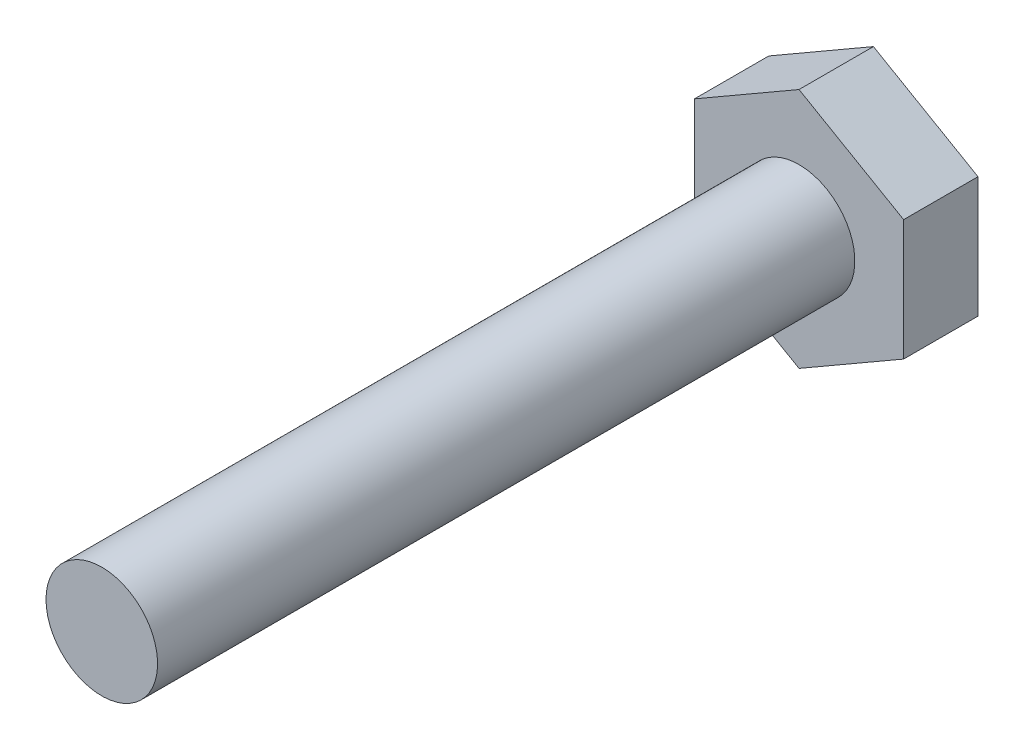
ISO-10303-21;
HEADER;
FILE_DESCRIPTION(('STEP AP214'),'2;1');
FILE_NAME('part.step','',(''),(''),'','','');
FILE_SCHEMA(('AUTOMOTIVE_DESIGN { 1 0 10303 214 1 1 1 1 }'));
ENDSEC;
DATA;
#1=APPLICATION_CONTEXT('core data for automotive mechanical design processes');
#2=APPLICATION_PROTOCOL_DEFINITION('international standard','automotive_design',2000,#1);
#3=PRODUCT_CONTEXT('',#1,'mechanical');
#4=PRODUCT('Part','Part','',(#3));
#5=PRODUCT_RELATED_PRODUCT_CATEGORY('part','',(#4));
#6=PRODUCT_DEFINITION_FORMATION('','',#4);
#7=PRODUCT_DEFINITION_CONTEXT('part definition',#1,'design');
#8=PRODUCT_DEFINITION('design','',#6,#7);
#9=PRODUCT_DEFINITION_SHAPE('','',#8);
#10=(LENGTH_UNIT() NAMED_UNIT(*) SI_UNIT(.MILLI.,.METRE.));
#11=(NAMED_UNIT(*) PLANE_ANGLE_UNIT() SI_UNIT($,.RADIAN.));
#12=(NAMED_UNIT(*) SI_UNIT($,.STERADIAN.) SOLID_ANGLE_UNIT());
#13=UNCERTAINTY_MEASURE_WITH_UNIT(LENGTH_MEASURE(1.E-05),#10,'distance_accuracy_value','');
#14=(GEOMETRIC_REPRESENTATION_CONTEXT(3) GLOBAL_UNCERTAINTY_ASSIGNED_CONTEXT((#13)) GLOBAL_UNIT_ASSIGNED_CONTEXT((#10,
#11,#12)) REPRESENTATION_CONTEXT('',''));
#15=CARTESIAN_POINT('',(0.,0.,0.));
#16=DIRECTION('',(0.,0.,1.));
#17=DIRECTION('',(1.,0.,0.));
#18=AXIS2_PLACEMENT_3D('',#15,#16,#17);
#19=CARTESIAN_POINT('',(-5.715,3.29955678841871,4.064));
#20=DIRECTION('',(0.5,-0.866025403784439,0.));
#21=DIRECTION('',(0.866025403784439,0.5,0.));
#22=AXIS2_PLACEMENT_3D('',#19,#20,#21);
#23=PLANE('',#22);
#24=DIRECTION('',(-0.866025403784439,-0.5,0.));
#25=VECTOR('',#24,1.);
#26=CARTESIAN_POINT('',(-5.715,3.29955678841871,0.));
#27=LINE('',#26,#25);
#28=CARTESIAN_POINT('',(0.,6.59911357683743,0.));
#29=VERTEX_POINT('',#28);
#30=CARTESIAN_POINT('',(-5.715,3.29955678841871,0.));
#31=VERTEX_POINT('',#30);
#32=EDGE_CURVE('E119',#29,#31,#27,.T.);
#33=ORIENTED_EDGE('',*,*,#32,.T.);
#34=DIRECTION('',(0.,0.,-1.));
#35=VECTOR('',#34,1.);
#36=CARTESIAN_POINT('',(-5.715,3.29955678841871,4.064));
#37=LINE('',#36,#35);
#38=CARTESIAN_POINT('',(-5.715,3.29955678841871,4.064));
#39=VERTEX_POINT('',#38);
#40=EDGE_CURVE('E36',#39,#31,#37,.T.);
#41=ORIENTED_EDGE('',*,*,#40,.F.);
#42=DIRECTION('',(-0.866025403784439,-0.5,0.));
#43=VECTOR('',#42,1.);
#44=CARTESIAN_POINT('',(-5.715,3.29955678841871,4.064));
#45=LINE('',#44,#43);
#46=CARTESIAN_POINT('',(0.,6.59911357683743,4.064));
#47=VERTEX_POINT('',#46);
#48=EDGE_CURVE('E130',#47,#39,#45,.T.);
#49=ORIENTED_EDGE('',*,*,#48,.F.);
#50=DIRECTION('',(0.,0.,-1.));
#51=VECTOR('',#50,1.);
#52=CARTESIAN_POINT('',(0.,6.59911357683743,4.064));
#53=LINE('',#52,#51);
#54=EDGE_CURVE('E115',#47,#29,#53,.T.);
#55=ORIENTED_EDGE('',*,*,#54,.T.);
#56=EDGE_LOOP('',(#33,#41,#49,#55));
#57=FACE_BOUND('',#56,.T.);
#58=ADVANCED_FACE('F33',(#57),#23,.F.);
#59=CARTESIAN_POINT('',(-5.715,3.29955678841871,4.064));
#60=DIRECTION('',(1.,0.,0.));
#61=DIRECTION('',(0.,0.,-1.));
#62=AXIS2_PLACEMENT_3D('',#59,#60,#61);
#63=PLANE('',#62);
#64=DIRECTION('',(0.,-1.,0.));
#65=VECTOR('',#64,1.);
#66=CARTESIAN_POINT('',(-5.715,3.29955678841871,0.));
#67=LINE('',#66,#65);
#68=CARTESIAN_POINT('',(-5.715,-3.29955678841871,0.));
#69=VERTEX_POINT('',#68);
#70=EDGE_CURVE('E122',#31,#69,#67,.T.);
#71=ORIENTED_EDGE('',*,*,#70,.T.);
#72=DIRECTION('',(0.,0.,-1.));
#73=VECTOR('',#72,1.);
#74=CARTESIAN_POINT('',(-5.715,-3.29955678841871,4.064));
#75=LINE('',#74,#73);
#76=CARTESIAN_POINT('',(-5.715,-3.29955678841871,4.064));
#77=VERTEX_POINT('',#76);
#78=EDGE_CURVE('E133',#77,#69,#75,.T.);
#79=ORIENTED_EDGE('',*,*,#78,.F.);
#80=DIRECTION('',(0.,-1.,0.));
#81=VECTOR('',#80,1.);
#82=CARTESIAN_POINT('',(-5.715,3.29955678841871,4.064));
#83=LINE('',#82,#81);
#84=EDGE_CURVE('E88',#39,#77,#83,.T.);
#85=ORIENTED_EDGE('',*,*,#84,.F.);
#86=ORIENTED_EDGE('',*,*,#40,.T.);
#87=EDGE_LOOP('',(#71,#79,#85,#86));
#88=FACE_BOUND('',#87,.T.);
#89=ADVANCED_FACE('F138',(#88),#63,.F.);
#90=CARTESIAN_POINT('',(-5.715,-3.29955678841871,4.064));
#91=DIRECTION('',(0.5,0.866025403784439,0.));
#92=DIRECTION('',(-0.866025403784439,0.5,0.));
#93=AXIS2_PLACEMENT_3D('',#90,#91,#92);
#94=PLANE('',#93);
#95=DIRECTION('',(0.866025403784439,-0.5,0.));
#96=VECTOR('',#95,1.);
#97=CARTESIAN_POINT('',(-5.715,-3.29955678841871,0.));
#98=LINE('',#97,#96);
#99=CARTESIAN_POINT('',(0.,-6.59911357683743,0.));
#100=VERTEX_POINT('',#99);
#101=EDGE_CURVE('E125',#69,#100,#98,.T.);
#102=ORIENTED_EDGE('',*,*,#101,.T.);
#103=DIRECTION('',(0.,0.,-1.));
#104=VECTOR('',#103,1.);
#105=CARTESIAN_POINT('',(0.,-6.59911357683743,4.064));
#106=LINE('',#105,#104);
#107=CARTESIAN_POINT('',(0.,-6.59911357683743,4.064));
#108=VERTEX_POINT('',#107);
#109=EDGE_CURVE('E110',#108,#100,#106,.T.);
#110=ORIENTED_EDGE('',*,*,#109,.F.);
#111=DIRECTION('',(0.866025403784439,-0.5,0.));
#112=VECTOR('',#111,1.);
#113=CARTESIAN_POINT('',(-5.715,-3.29955678841871,4.064));
#114=LINE('',#113,#112);
#115=EDGE_CURVE('E101',#77,#108,#114,.T.);
#116=ORIENTED_EDGE('',*,*,#115,.F.);
#117=ORIENTED_EDGE('',*,*,#78,.T.);
#118=EDGE_LOOP('',(#102,#110,#116,#117));
#119=FACE_BOUND('',#118,.T.);
#120=ADVANCED_FACE('F144',(#119),#94,.F.);
#121=CARTESIAN_POINT('',(0.,-6.59911357683743,4.064));
#122=DIRECTION('',(-0.500000000000001,0.866025403784438,0.));
#123=DIRECTION('',(-0.866025403784438,-0.500000000000001,0.));
#124=AXIS2_PLACEMENT_3D('',#121,#122,#123);
#125=PLANE('',#124);
#126=DIRECTION('',(0.866025403784438,0.500000000000001,0.));
#127=VECTOR('',#126,1.);
#128=CARTESIAN_POINT('',(0.,-6.59911357683743,0.));
#129=LINE('',#128,#127);
#130=CARTESIAN_POINT('',(5.715,-3.29955678841871,0.));
#131=VERTEX_POINT('',#130);
#132=EDGE_CURVE('E109',#100,#131,#129,.T.);
#133=ORIENTED_EDGE('',*,*,#132,.T.);
#134=DIRECTION('',(0.,0.,-1.));
#135=VECTOR('',#134,1.);
#136=CARTESIAN_POINT('',(5.715,-3.29955678841871,4.064));
#137=LINE('',#136,#135);
#138=CARTESIAN_POINT('',(5.715,-3.29955678841871,4.064));
#139=VERTEX_POINT('',#138);
#140=EDGE_CURVE('E106',#139,#131,#137,.T.);
#141=ORIENTED_EDGE('',*,*,#140,.F.);
#142=DIRECTION('',(0.866025403784438,0.500000000000001,0.));
#143=VECTOR('',#142,1.);
#144=CARTESIAN_POINT('',(0.,-6.59911357683743,4.064));
#145=LINE('',#144,#143);
#146=EDGE_CURVE('E95',#108,#139,#145,.T.);
#147=ORIENTED_EDGE('',*,*,#146,.F.);
#148=ORIENTED_EDGE('',*,*,#109,.T.);
#149=EDGE_LOOP('',(#133,#141,#147,#148));
#150=FACE_BOUND('',#149,.T.);
#151=ADVANCED_FACE('F107',(#150),#125,.F.);
#152=CARTESIAN_POINT('',(5.715,3.29955678841871,4.064));
#153=DIRECTION('',(-1.,0.,0.));
#154=DIRECTION('',(0.,-1.,0.));
#155=AXIS2_PLACEMENT_3D('',#152,#153,#154);
#156=PLANE('',#155);
#157=DIRECTION('',(0.,1.,0.));
#158=VECTOR('',#157,1.);
#159=CARTESIAN_POINT('',(5.715,3.29955678841871,0.));
#160=LINE('',#159,#158);
#161=CARTESIAN_POINT('',(5.715,3.29955678841871,0.));
#162=VERTEX_POINT('',#161);
#163=EDGE_CURVE('E73',#131,#162,#160,.T.);
#164=ORIENTED_EDGE('',*,*,#163,.T.);
#165=DIRECTION('',(0.,0.,-1.));
#166=VECTOR('',#165,1.);
#167=CARTESIAN_POINT('',(5.715,3.29955678841871,4.064));
#168=LINE('',#167,#166);
#169=CARTESIAN_POINT('',(5.715,3.29955678841871,4.064));
#170=VERTEX_POINT('',#169);
#171=EDGE_CURVE('E111',#170,#162,#168,.T.);
#172=ORIENTED_EDGE('',*,*,#171,.F.);
#173=DIRECTION('',(0.,1.,0.));
#174=VECTOR('',#173,1.);
#175=CARTESIAN_POINT('',(5.715,3.29955678841871,4.064));
#176=LINE('',#175,#174);
#177=EDGE_CURVE('E99',#139,#170,#176,.T.);
#178=ORIENTED_EDGE('',*,*,#177,.F.);
#179=ORIENTED_EDGE('',*,*,#140,.T.);
#180=EDGE_LOOP('',(#164,#172,#178,#179));
#181=FACE_BOUND('',#180,.T.);
#182=ADVANCED_FACE('F113',(#181),#156,.F.);
#183=CARTESIAN_POINT('',(0.,6.59911357683743,4.064));
#184=DIRECTION('',(-0.500000000000001,-0.866025403784438,0.));
#185=DIRECTION('',(0.866025403784438,-0.500000000000001,0.));
#186=AXIS2_PLACEMENT_3D('',#183,#184,#185);
#187=PLANE('',#186);
#188=DIRECTION('',(-0.866025403784438,0.500000000000001,0.));
#189=VECTOR('',#188,1.);
#190=CARTESIAN_POINT('',(0.,6.59911357683743,0.));
#191=LINE('',#190,#189);
#192=EDGE_CURVE('E79',#162,#29,#191,.T.);
#193=ORIENTED_EDGE('',*,*,#192,.T.);
#194=ORIENTED_EDGE('',*,*,#54,.F.);
#195=DIRECTION('',(-0.866025403784438,0.500000000000001,0.));
#196=VECTOR('',#195,1.);
#197=CARTESIAN_POINT('',(0.,6.59911357683743,4.064));
#198=LINE('',#197,#196);
#199=EDGE_CURVE('E50',#170,#47,#198,.T.);
#200=ORIENTED_EDGE('',*,*,#199,.F.);
#201=ORIENTED_EDGE('',*,*,#171,.T.);
#202=EDGE_LOOP('',(#193,#194,#200,#201));
#203=FACE_BOUND('',#202,.T.);
#204=ADVANCED_FACE('F160',(#203),#187,.F.);
#205=CARTESIAN_POINT('',(0.,0.,4.064));
#206=DIRECTION('',(0.,0.,-1.));
#207=DIRECTION('',(-1.,0.,0.));
#208=AXIS2_PLACEMENT_3D('',#205,#206,#207);
#209=PLANE('',#208);
#210=CARTESIAN_POINT('',(0.,0.,4.064));
#211=DIRECTION('',(0.,0.,1.));
#212=DIRECTION('',(1.,0.,0.));
#213=AXIS2_PLACEMENT_3D('',#210,#211,#212);
#214=CIRCLE('',#213,3.048);
#215=CARTESIAN_POINT('',(-3.048,0.,4.064));
#216=VERTEX_POINT('',#215);
#217=EDGE_CURVE('E11',#216,#216,#214,.T.);
#218=ORIENTED_EDGE('',*,*,#217,.F.);
#219=EDGE_LOOP('',(#218));
#220=FACE_BOUND('',#219,.T.);
#221=ORIENTED_EDGE('',*,*,#48,.T.);
#222=ORIENTED_EDGE('',*,*,#84,.T.);
#223=ORIENTED_EDGE('',*,*,#115,.T.);
#224=ORIENTED_EDGE('',*,*,#146,.T.);
#225=ORIENTED_EDGE('',*,*,#177,.T.);
#226=ORIENTED_EDGE('',*,*,#199,.T.);
#227=EDGE_LOOP('',(#221,#222,#223,#224,#225,#226));
#228=FACE_BOUND('',#227,.T.);
#229=ADVANCED_FACE('F97',(#220,#228),#209,.F.);
#230=CARTESIAN_POINT('',(0.,0.,0.));
#231=DIRECTION('',(0.,0.,-1.));
#232=DIRECTION('',(-1.,0.,0.));
#233=AXIS2_PLACEMENT_3D('',#230,#231,#232);
#234=PLANE('',#233);
#235=ORIENTED_EDGE('',*,*,#32,.F.);
#236=ORIENTED_EDGE('',*,*,#192,.F.);
#237=ORIENTED_EDGE('',*,*,#163,.F.);
#238=ORIENTED_EDGE('',*,*,#132,.F.);
#239=ORIENTED_EDGE('',*,*,#101,.F.);
#240=ORIENTED_EDGE('',*,*,#70,.F.);
#241=EDGE_LOOP('',(#235,#236,#237,#238,#239,#240));
#242=FACE_BOUND('',#241,.T.);
#243=ADVANCED_FACE('F143',(#242),#234,.T.);
#244=CARTESIAN_POINT('',(0.,0.,42.164));
#245=DIRECTION('',(0.,0.,-1.));
#246=DIRECTION('',(-1.,0.,0.));
#247=AXIS2_PLACEMENT_3D('',#244,#245,#246);
#248=CYLINDRICAL_SURFACE('',#247,3.048);
#249=CARTESIAN_POINT('',(0.,0.,42.164));
#250=DIRECTION('',(0.,0.,1.));
#251=DIRECTION('',(1.,0.,0.));
#252=AXIS2_PLACEMENT_3D('',#249,#250,#251);
#253=CIRCLE('',#252,3.048);
#254=CARTESIAN_POINT('',(-3.048,0.,42.164));
#255=VERTEX_POINT('',#254);
#256=EDGE_CURVE('E123',#255,#255,#253,.T.);
#257=CARTESIAN_POINT('',(-3.048,0.,42.164));
#258=CARTESIAN_POINT('',(-3.048,0.,41.767125));
#259=CARTESIAN_POINT('',(-3.048,0.,41.37025));
#260=CARTESIAN_POINT('',(-3.048,0.,40.5765));
#261=CARTESIAN_POINT('',(-3.048,0.,40.179625));
#262=CARTESIAN_POINT('',(-3.048,0.,39.385875));
#263=CARTESIAN_POINT('',(-3.048,0.,38.989));
#264=CARTESIAN_POINT('',(-3.048,0.,38.19525));
#265=CARTESIAN_POINT('',(-3.048,0.,37.798375));
#266=CARTESIAN_POINT('',(-3.048,0.,37.004625));
#267=CARTESIAN_POINT('',(-3.048,0.,36.60775));
#268=CARTESIAN_POINT('',(-3.048,0.,35.814));
#269=CARTESIAN_POINT('',(-3.048,0.,35.417125));
#270=CARTESIAN_POINT('',(-3.048,0.,34.623375));
#271=CARTESIAN_POINT('',(-3.048,0.,34.2265));
#272=CARTESIAN_POINT('',(-3.048,0.,33.43275));
#273=CARTESIAN_POINT('',(-3.048,0.,33.035875));
#274=CARTESIAN_POINT('',(-3.048,0.,32.242125));
#275=CARTESIAN_POINT('',(-3.048,0.,31.84525));
#276=CARTESIAN_POINT('',(-3.048,0.,31.0515));
#277=CARTESIAN_POINT('',(-3.048,0.,30.654625));
#278=CARTESIAN_POINT('',(-3.048,0.,29.860875));
#279=CARTESIAN_POINT('',(-3.048,0.,29.464));
#280=CARTESIAN_POINT('',(-3.048,0.,28.67025));
#281=CARTESIAN_POINT('',(-3.048,0.,28.273375));
#282=CARTESIAN_POINT('',(-3.048,0.,27.479625));
#283=CARTESIAN_POINT('',(-3.048,0.,27.08275));
#284=CARTESIAN_POINT('',(-3.048,0.,26.289));
#285=CARTESIAN_POINT('',(-3.048,0.,25.892125));
#286=CARTESIAN_POINT('',(-3.048,0.,25.098375));
#287=CARTESIAN_POINT('',(-3.048,0.,24.7015));
#288=CARTESIAN_POINT('',(-3.048,0.,23.90775));
#289=CARTESIAN_POINT('',(-3.048,0.,23.510875));
#290=CARTESIAN_POINT('',(-3.048,0.,22.717125));
#291=CARTESIAN_POINT('',(-3.048,0.,22.32025));
#292=CARTESIAN_POINT('',(-3.048,0.,21.5265));
#293=CARTESIAN_POINT('',(-3.048,0.,21.129625));
#294=CARTESIAN_POINT('',(-3.048,0.,20.335875));
#295=CARTESIAN_POINT('',(-3.048,0.,19.939));
#296=CARTESIAN_POINT('',(-3.048,0.,19.14525));
#297=CARTESIAN_POINT('',(-3.048,0.,18.748375));
#298=CARTESIAN_POINT('',(-3.048,0.,17.954625));
#299=CARTESIAN_POINT('',(-3.048,0.,17.55775));
#300=CARTESIAN_POINT('',(-3.048,0.,16.764));
#301=CARTESIAN_POINT('',(-3.048,0.,16.367125));
#302=CARTESIAN_POINT('',(-3.048,0.,15.573375));
#303=CARTESIAN_POINT('',(-3.048,0.,15.1765));
#304=CARTESIAN_POINT('',(-3.048,0.,14.38275));
#305=CARTESIAN_POINT('',(-3.048,0.,13.985875));
#306=CARTESIAN_POINT('',(-3.048,0.,13.192125));
#307=CARTESIAN_POINT('',(-3.048,0.,12.79525));
#308=CARTESIAN_POINT('',(-3.048,0.,12.0015));
#309=CARTESIAN_POINT('',(-3.048,0.,11.604625));
#310=CARTESIAN_POINT('',(-3.048,0.,10.810875));
#311=CARTESIAN_POINT('',(-3.048,0.,10.414));
#312=CARTESIAN_POINT('',(-3.048,0.,9.62025));
#313=CARTESIAN_POINT('',(-3.048,0.,9.223375));
#314=CARTESIAN_POINT('',(-3.048,0.,8.429625));
#315=CARTESIAN_POINT('',(-3.048,0.,8.03275));
#316=CARTESIAN_POINT('',(-3.048,0.,7.239));
#317=CARTESIAN_POINT('',(-3.048,0.,6.842125));
#318=CARTESIAN_POINT('',(-3.048,0.,6.048375));
#319=CARTESIAN_POINT('',(-3.048,0.,5.6515));
#320=CARTESIAN_POINT('',(-3.048,0.,4.85775));
#321=CARTESIAN_POINT('',(-3.048,0.,4.460875));
#322=CARTESIAN_POINT('',(-3.048,0.,4.064));
#323=B_SPLINE_CURVE_WITH_KNOTS('',3,(#257,#258,#259,#260,#261,#262,#263,#264,#265,#266,#267,
#268,#269,#270,#271,#272,#273,#274,#275,#276,#277,#278,#279,#280,#281,#282,#283,#284,#285,#286,
#287,#288,#289,#290,#291,#292,#293,#294,#295,#296,#297,#298,#299,#300,#301,#302,#303,#304,#305,
#306,#307,#308,#309,#310,#311,#312,#313,#314,#315,#316,#317,#318,#319,#320,#321,#322),
.UNSPECIFIED.,.F.,.F.,(4,2,2,2,2,2,2,2,2,2,2,2,2,2,2,2,2,2,2,2,2,2,2,2,2,2,2,2,2,2,2,2,4),(0.,
1.19062499999999,2.38124999999999,3.571875,4.7625,5.953125,7.14375,8.33437499999999,
9.52499999999999,10.715625,11.90625,13.096875,14.2875,15.478125,16.66875,17.859375,19.05,
20.240625,21.43125,22.621875,23.8125,25.003125,26.19375,27.384375,28.575,29.765625,30.95625,
32.146875,33.3375,34.528125,35.71875,36.909375,38.1),.UNSPECIFIED.);
#324=EDGE_CURVE('BSEAM153',#255,#216,#323,.T.);
#325=ORIENTED_EDGE('',*,*,#256,.F.);
#326=ORIENTED_EDGE('',*,*,#217,.T.);
#327=ORIENTED_EDGE('',*,*,#324,.T.);
#328=ORIENTED_EDGE('',*,*,#324,.F.);
#329=EDGE_LOOP('',(#325,#327,#326,#328));
#330=FACE_BOUND('',#329,.T.);
#331=ADVANCED_FACE('F153',(#330),#248,.T.);
#332=CARTESIAN_POINT('',(0.,0.,42.164));
#333=DIRECTION('',(0.,0.,1.));
#334=DIRECTION('',(1.,0.,0.));
#335=AXIS2_PLACEMENT_3D('',#332,#333,#334);
#336=PLANE('',#335);
#337=ORIENTED_EDGE('',*,*,#256,.T.);
#338=EDGE_LOOP('',(#337));
#339=FACE_BOUND('',#338,.T.);
#340=ADVANCED_FACE('F151',(#339),#336,.T.);
#341=CLOSED_SHELL('',(#58,#89,#120,#151,#182,#204,#229,#243,#331,#340));
#342=MANIFOLD_SOLID_BREP('B2',#341);
#343=ADVANCED_BREP_SHAPE_REPRESENTATION('',(#18,#342),#14);
#344=SHAPE_DEFINITION_REPRESENTATION(#9,#343);
ENDSEC;
END-ISO-10303-21;
